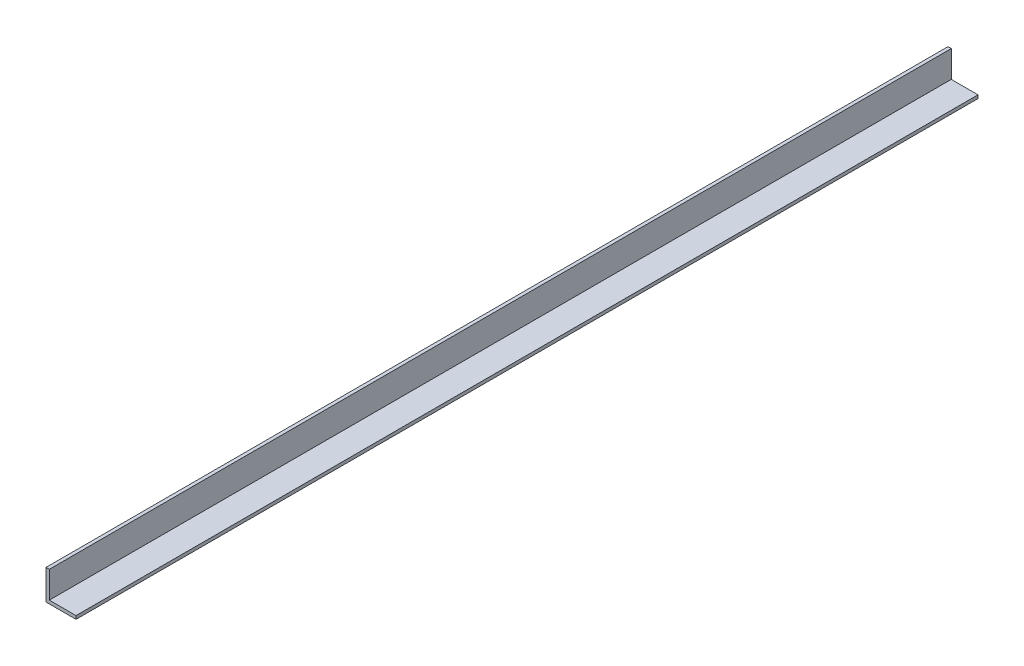
ISO-10303-21;
HEADER;
FILE_DESCRIPTION(('STEP AP214'),'2;1');
FILE_NAME('part.step','',(''),(''),'','','');
FILE_SCHEMA(('AUTOMOTIVE_DESIGN { 1 0 10303 214 1 1 1 1 }'));
ENDSEC;
DATA;
#1=APPLICATION_CONTEXT('core data for automotive mechanical design processes');
#2=APPLICATION_PROTOCOL_DEFINITION('international standard','automotive_design',2000,#1);
#3=PRODUCT_CONTEXT('',#1,'mechanical');
#4=PRODUCT('Part','Part','',(#3));
#5=PRODUCT_RELATED_PRODUCT_CATEGORY('part','',(#4));
#6=PRODUCT_DEFINITION_FORMATION('','',#4);
#7=PRODUCT_DEFINITION_CONTEXT('part definition',#1,'design');
#8=PRODUCT_DEFINITION('design','',#6,#7);
#9=PRODUCT_DEFINITION_SHAPE('','',#8);
#10=(LENGTH_UNIT() NAMED_UNIT(*) SI_UNIT(.MILLI.,.METRE.));
#11=(NAMED_UNIT(*) PLANE_ANGLE_UNIT() SI_UNIT($,.RADIAN.));
#12=(NAMED_UNIT(*) SI_UNIT($,.STERADIAN.) SOLID_ANGLE_UNIT());
#13=UNCERTAINTY_MEASURE_WITH_UNIT(LENGTH_MEASURE(1.E-05),#10,'distance_accuracy_value','');
#14=(GEOMETRIC_REPRESENTATION_CONTEXT(3) GLOBAL_UNCERTAINTY_ASSIGNED_CONTEXT((#13)) GLOBAL_UNIT_ASSIGNED_CONTEXT((#10,
#11,#12)) REPRESENTATION_CONTEXT('',''));
#15=CARTESIAN_POINT('',(0.,0.,0.));
#16=DIRECTION('',(0.,0.,1.));
#17=DIRECTION('',(1.,0.,0.));
#18=AXIS2_PLACEMENT_3D('',#15,#16,#17);
#19=CARTESIAN_POINT('',(22.23,203.,-6100.));
#20=DIRECTION('',(0.,1.,0.));
#21=DIRECTION('',(0.,0.,1.));
#22=AXIS2_PLACEMENT_3D('',#19,#20,#21);
#23=PLANE('',#22);
#24=DIRECTION('',(-1.,0.,0.));
#25=VECTOR('',#24,1.);
#26=CARTESIAN_POINT('',(22.23,203.,0.));
#27=LINE('',#26,#25);
#28=CARTESIAN_POINT('',(22.23,203.,0.));
#29=VERTEX_POINT('',#28);
#30=CARTESIAN_POINT('',(0.,203.,0.));
#31=VERTEX_POINT('',#30);
#32=EDGE_CURVE('E118',#29,#31,#27,.T.);
#33=ORIENTED_EDGE('',*,*,#32,.F.);
#34=DIRECTION('',(0.,0.,1.));
#35=VECTOR('',#34,1.);
#36=CARTESIAN_POINT('',(22.23,203.,-6100.));
#37=LINE('',#36,#35);
#38=CARTESIAN_POINT('',(22.23,203.,-6100.));
#39=VERTEX_POINT('',#38);
#40=EDGE_CURVE('E11',#39,#29,#37,.T.);
#41=ORIENTED_EDGE('',*,*,#40,.F.);
#42=DIRECTION('',(-1.,0.,0.));
#43=VECTOR('',#42,1.);
#44=CARTESIAN_POINT('',(22.23,203.,-6100.));
#45=LINE('',#44,#43);
#46=CARTESIAN_POINT('',(0.,203.,-6100.));
#47=VERTEX_POINT('',#46);
#48=EDGE_CURVE('E132',#39,#47,#45,.T.);
#49=ORIENTED_EDGE('',*,*,#48,.T.);
#50=DIRECTION('',(0.,0.,1.));
#51=VECTOR('',#50,1.);
#52=CARTESIAN_POINT('',(0.,203.,-6100.));
#53=LINE('',#52,#51);
#54=EDGE_CURVE('E36',#47,#31,#53,.T.);
#55=ORIENTED_EDGE('',*,*,#54,.T.);
#56=EDGE_LOOP('',(#33,#41,#49,#55));
#57=FACE_BOUND('',#56,.T.);
#58=ADVANCED_FACE('F33',(#57),#23,.T.);
#59=CARTESIAN_POINT('',(22.23,22.23,-6100.));
#60=DIRECTION('',(1.,0.,0.));
#61=DIRECTION('',(0.,1.,0.));
#62=AXIS2_PLACEMENT_3D('',#59,#60,#61);
#63=PLANE('',#62);
#64=DIRECTION('',(0.,1.,0.));
#65=VECTOR('',#64,1.);
#66=CARTESIAN_POINT('',(22.23,22.23,0.));
#67=LINE('',#66,#65);
#68=CARTESIAN_POINT('',(22.23,22.23,0.));
#69=VERTEX_POINT('',#68);
#70=EDGE_CURVE('E130',#69,#29,#67,.T.);
#71=ORIENTED_EDGE('',*,*,#70,.F.);
#72=DIRECTION('',(0.,0.,1.));
#73=VECTOR('',#72,1.);
#74=CARTESIAN_POINT('',(22.23,22.23,-6100.));
#75=LINE('',#74,#73);
#76=CARTESIAN_POINT('',(22.23,22.23,-6100.));
#77=VERTEX_POINT('',#76);
#78=EDGE_CURVE('E42',#77,#69,#75,.T.);
#79=ORIENTED_EDGE('',*,*,#78,.F.);
#80=DIRECTION('',(0.,1.,0.));
#81=VECTOR('',#80,1.);
#82=CARTESIAN_POINT('',(22.23,22.23,-6100.));
#83=LINE('',#82,#81);
#84=EDGE_CURVE('E108',#77,#39,#83,.T.);
#85=ORIENTED_EDGE('',*,*,#84,.T.);
#86=ORIENTED_EDGE('',*,*,#40,.T.);
#87=EDGE_LOOP('',(#71,#79,#85,#86));
#88=FACE_BOUND('',#87,.T.);
#89=ADVANCED_FACE('F140',(#88),#63,.T.);
#90=CARTESIAN_POINT('',(203.,22.23,-6100.));
#91=DIRECTION('',(0.,1.,0.));
#92=DIRECTION('',(-1.,0.,0.));
#93=AXIS2_PLACEMENT_3D('',#90,#91,#92);
#94=PLANE('',#93);
#95=DIRECTION('',(-1.,0.,0.));
#96=VECTOR('',#95,1.);
#97=CARTESIAN_POINT('',(203.,22.23,0.));
#98=LINE('',#97,#96);
#99=CARTESIAN_POINT('',(203.,22.23,0.));
#100=VERTEX_POINT('',#99);
#101=EDGE_CURVE('E95',#100,#69,#98,.T.);
#102=ORIENTED_EDGE('',*,*,#101,.F.);
#103=DIRECTION('',(0.,0.,1.));
#104=VECTOR('',#103,1.);
#105=CARTESIAN_POINT('',(203.,22.23,-6100.));
#106=LINE('',#105,#104);
#107=CARTESIAN_POINT('',(203.,22.23,-6100.));
#108=VERTEX_POINT('',#107);
#109=EDGE_CURVE('E90',#108,#100,#106,.T.);
#110=ORIENTED_EDGE('',*,*,#109,.F.);
#111=DIRECTION('',(-1.,0.,0.));
#112=VECTOR('',#111,1.);
#113=CARTESIAN_POINT('',(203.,22.23,-6100.));
#114=LINE('',#113,#112);
#115=EDGE_CURVE('E93',#108,#77,#114,.T.);
#116=ORIENTED_EDGE('',*,*,#115,.T.);
#117=ORIENTED_EDGE('',*,*,#78,.T.);
#118=EDGE_LOOP('',(#102,#110,#116,#117));
#119=FACE_BOUND('',#118,.T.);
#120=ADVANCED_FACE('F92',(#119),#94,.T.);
#121=CARTESIAN_POINT('',(203.,0.,-6100.));
#122=DIRECTION('',(1.,0.,0.));
#123=DIRECTION('',(0.,0.,-1.));
#124=AXIS2_PLACEMENT_3D('',#121,#122,#123);
#125=PLANE('',#124);
#126=DIRECTION('',(0.,1.,0.));
#127=VECTOR('',#126,1.);
#128=CARTESIAN_POINT('',(203.,0.,0.));
#129=LINE('',#128,#127);
#130=CARTESIAN_POINT('',(203.,0.,0.));
#131=VERTEX_POINT('',#130);
#132=EDGE_CURVE('E127',#131,#100,#129,.T.);
#133=ORIENTED_EDGE('',*,*,#132,.F.);
#134=DIRECTION('',(0.,0.,1.));
#135=VECTOR('',#134,1.);
#136=CARTESIAN_POINT('',(203.,0.,-6100.));
#137=LINE('',#136,#135);
#138=CARTESIAN_POINT('',(203.,0.,-6100.));
#139=VERTEX_POINT('',#138);
#140=EDGE_CURVE('E100',#139,#131,#137,.T.);
#141=ORIENTED_EDGE('',*,*,#140,.F.);
#142=DIRECTION('',(0.,1.,0.));
#143=VECTOR('',#142,1.);
#144=CARTESIAN_POINT('',(203.,0.,-6100.));
#145=LINE('',#144,#143);
#146=EDGE_CURVE('E106',#139,#108,#145,.T.);
#147=ORIENTED_EDGE('',*,*,#146,.T.);
#148=ORIENTED_EDGE('',*,*,#109,.T.);
#149=EDGE_LOOP('',(#133,#141,#147,#148));
#150=FACE_BOUND('',#149,.T.);
#151=ADVANCED_FACE('F110',(#150),#125,.T.);
#152=CARTESIAN_POINT('',(0.,0.,-6100.));
#153=DIRECTION('',(0.,-1.,0.));
#154=DIRECTION('',(0.,0.,-1.));
#155=AXIS2_PLACEMENT_3D('',#152,#153,#154);
#156=PLANE('',#155);
#157=DIRECTION('',(1.,0.,0.));
#158=VECTOR('',#157,1.);
#159=CARTESIAN_POINT('',(0.,0.,0.));
#160=LINE('',#159,#158);
#161=CARTESIAN_POINT('',(0.,0.,0.));
#162=VERTEX_POINT('',#161);
#163=EDGE_CURVE('E124',#162,#131,#160,.T.);
#164=ORIENTED_EDGE('',*,*,#163,.F.);
#165=DIRECTION('',(0.,0.,1.));
#166=VECTOR('',#165,1.);
#167=CARTESIAN_POINT('',(0.,0.,-6100.));
#168=LINE('',#167,#166);
#169=CARTESIAN_POINT('',(0.,0.,-6100.));
#170=VERTEX_POINT('',#169);
#171=EDGE_CURVE('E135',#170,#162,#168,.T.);
#172=ORIENTED_EDGE('',*,*,#171,.F.);
#173=DIRECTION('',(1.,0.,0.));
#174=VECTOR('',#173,1.);
#175=CARTESIAN_POINT('',(0.,0.,-6100.));
#176=LINE('',#175,#174);
#177=EDGE_CURVE('E111',#170,#139,#176,.T.);
#178=ORIENTED_EDGE('',*,*,#177,.T.);
#179=ORIENTED_EDGE('',*,*,#140,.T.);
#180=EDGE_LOOP('',(#164,#172,#178,#179));
#181=FACE_BOUND('',#180,.T.);
#182=ADVANCED_FACE('F153',(#181),#156,.T.);
#183=CARTESIAN_POINT('',(0.,203.,-6100.));
#184=DIRECTION('',(-1.,0.,0.));
#185=DIRECTION('',(0.,-1.,0.));
#186=AXIS2_PLACEMENT_3D('',#183,#184,#185);
#187=PLANE('',#186);
#188=DIRECTION('',(0.,-1.,0.));
#189=VECTOR('',#188,1.);
#190=CARTESIAN_POINT('',(0.,203.,0.));
#191=LINE('',#190,#189);
#192=EDGE_CURVE('E121',#31,#162,#191,.T.);
#193=ORIENTED_EDGE('',*,*,#192,.F.);
#194=ORIENTED_EDGE('',*,*,#54,.F.);
#195=DIRECTION('',(0.,-1.,0.));
#196=VECTOR('',#195,1.);
#197=CARTESIAN_POINT('',(0.,203.,-6100.));
#198=LINE('',#197,#196);
#199=EDGE_CURVE('E113',#47,#170,#198,.T.);
#200=ORIENTED_EDGE('',*,*,#199,.T.);
#201=ORIENTED_EDGE('',*,*,#171,.T.);
#202=EDGE_LOOP('',(#193,#194,#200,#201));
#203=FACE_BOUND('',#202,.T.);
#204=ADVANCED_FACE('F137',(#203),#187,.T.);
#205=CARTESIAN_POINT('',(0.,0.,-6100.));
#206=DIRECTION('',(0.,0.,1.));
#207=DIRECTION('',(1.,0.,0.));
#208=AXIS2_PLACEMENT_3D('',#205,#206,#207);
#209=PLANE('',#208);
#210=ORIENTED_EDGE('',*,*,#48,.F.);
#211=ORIENTED_EDGE('',*,*,#84,.F.);
#212=ORIENTED_EDGE('',*,*,#115,.F.);
#213=ORIENTED_EDGE('',*,*,#146,.F.);
#214=ORIENTED_EDGE('',*,*,#177,.F.);
#215=ORIENTED_EDGE('',*,*,#199,.F.);
#216=EDGE_LOOP('',(#210,#211,#212,#213,#214,#215));
#217=FACE_BOUND('',#216,.T.);
#218=ADVANCED_FACE('F104',(#217),#209,.F.);
#219=CARTESIAN_POINT('',(0.,0.,0.));
#220=DIRECTION('',(0.,0.,1.));
#221=DIRECTION('',(1.,0.,0.));
#222=AXIS2_PLACEMENT_3D('',#219,#220,#221);
#223=PLANE('',#222);
#224=ORIENTED_EDGE('',*,*,#32,.T.);
#225=ORIENTED_EDGE('',*,*,#192,.T.);
#226=ORIENTED_EDGE('',*,*,#163,.T.);
#227=ORIENTED_EDGE('',*,*,#132,.T.);
#228=ORIENTED_EDGE('',*,*,#101,.T.);
#229=ORIENTED_EDGE('',*,*,#70,.T.);
#230=EDGE_LOOP('',(#224,#225,#226,#227,#228,#229));
#231=FACE_BOUND('',#230,.T.);
#232=ADVANCED_FACE('F139',(#231),#223,.T.);
#233=CLOSED_SHELL('',(#58,#89,#120,#151,#182,#204,#218,#232));
#234=MANIFOLD_SOLID_BREP('B2',#233);
#235=ADVANCED_BREP_SHAPE_REPRESENTATION('',(#18,#234),#14);
#236=SHAPE_DEFINITION_REPRESENTATION(#9,#235);
ENDSEC;
END-ISO-10303-21;
